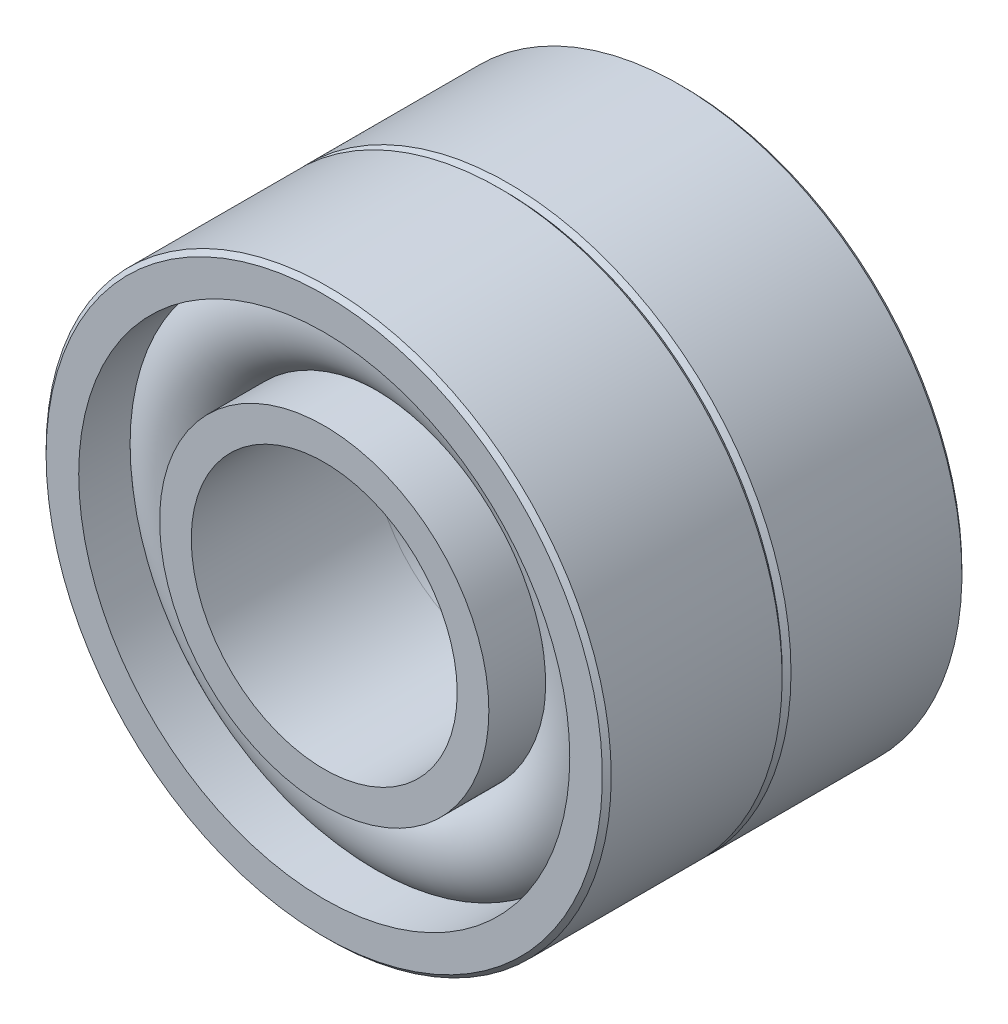
ISO-10303-21;
HEADER;
FILE_DESCRIPTION(('STEP AP214'),'2;1');
FILE_NAME('part.step','',(''),(''),'','','');
FILE_SCHEMA(('AUTOMOTIVE_DESIGN { 1 0 10303 214 1 1 1 1 }'));
ENDSEC;
DATA;
#1=APPLICATION_CONTEXT('core data for automotive mechanical design processes');
#2=APPLICATION_PROTOCOL_DEFINITION('international standard','automotive_design',2000,#1);
#3=PRODUCT_CONTEXT('',#1,'mechanical');
#4=PRODUCT('Part','Part','',(#3));
#5=PRODUCT_RELATED_PRODUCT_CATEGORY('part','',(#4));
#6=PRODUCT_DEFINITION_FORMATION('','',#4);
#7=PRODUCT_DEFINITION_CONTEXT('part definition',#1,'design');
#8=PRODUCT_DEFINITION('design','',#6,#7);
#9=PRODUCT_DEFINITION_SHAPE('','',#8);
#10=(LENGTH_UNIT() NAMED_UNIT(*) SI_UNIT(.MILLI.,.METRE.));
#11=(NAMED_UNIT(*) PLANE_ANGLE_UNIT() SI_UNIT($,.RADIAN.));
#12=(NAMED_UNIT(*) SI_UNIT($,.STERADIAN.) SOLID_ANGLE_UNIT());
#13=UNCERTAINTY_MEASURE_WITH_UNIT(LENGTH_MEASURE(1.E-05),#10,'distance_accuracy_value','');
#14=(GEOMETRIC_REPRESENTATION_CONTEXT(3) GLOBAL_UNCERTAINTY_ASSIGNED_CONTEXT((#13)) GLOBAL_UNIT_ASSIGNED_CONTEXT((#10,
#11,#12)) REPRESENTATION_CONTEXT('',''));
#15=CARTESIAN_POINT('',(0.,0.,0.));
#16=DIRECTION('',(0.,0.,1.));
#17=DIRECTION('',(1.,0.,0.));
#18=AXIS2_PLACEMENT_3D('',#15,#16,#17);
#19=CARTESIAN_POINT('',(0.,0.,0.));
#20=DIRECTION('',(0.,0.,1.));
#21=DIRECTION('',(1.,0.,0.));
#22=AXIS2_PLACEMENT_3D('',#19,#20,#21);
#23=CYLINDRICAL_SURFACE('',#22,6.);
#24=CARTESIAN_POINT('',(0.,0.,-4.05625));
#25=DIRECTION('',(0.,0.,1.));
#26=DIRECTION('',(1.,0.,0.));
#27=AXIS2_PLACEMENT_3D('',#24,#25,#26);
#28=CIRCLE('',#27,6.);
#29=CARTESIAN_POINT('',(6.,0.,-4.05625));
#30=VERTEX_POINT('',#29);
#31=EDGE_CURVE('P0_E18',#30,#30,#28,.F.);
#32=ORIENTED_EDGE('',*,*,#31,.T.);
#33=EDGE_LOOP('',(#32));
#34=FACE_BOUND('',#33,.T.);
#35=CARTESIAN_POINT('',(0.,0.,4.05625));
#36=DIRECTION('',(0.,0.,1.));
#37=DIRECTION('',(1.,0.,0.));
#38=AXIS2_PLACEMENT_3D('',#35,#36,#37);
#39=CIRCLE('',#38,6.);
#40=CARTESIAN_POINT('',(6.,0.,4.05625));
#41=VERTEX_POINT('',#40);
#42=EDGE_CURVE('P0_E75',#41,#41,#39,.T.);
#43=ORIENTED_EDGE('',*,*,#42,.T.);
#44=EDGE_LOOP('',(#43));
#45=FACE_BOUND('',#44,.T.);
#46=ADVANCED_FACE('P0_F15',(#34,#45),#23,.F.);
#47=CARTESIAN_POINT('',(0.,7.428,-4.05625));
#48=DIRECTION('',(0.,0.,1.));
#49=DIRECTION('',(1.,0.,0.));
#50=AXIS2_PLACEMENT_3D('',#47,#48,#49);
#51=PLANE('',#50);
#52=ORIENTED_EDGE('',*,*,#31,.F.);
#53=EDGE_LOOP('',(#52));
#54=FACE_BOUND('',#53,.T.);
#55=CARTESIAN_POINT('',(0.,0.,-4.05625));
#56=DIRECTION('',(0.,0.,1.));
#57=DIRECTION('',(1.,0.,0.));
#58=AXIS2_PLACEMENT_3D('',#55,#56,#57);
#59=CIRCLE('',#58,7.428);
#60=CARTESIAN_POINT('',(7.428,0.,-4.05625));
#61=VERTEX_POINT('',#60);
#62=EDGE_CURVE('P0_E73',#61,#61,#59,.T.);
#63=ORIENTED_EDGE('',*,*,#62,.F.);
#64=EDGE_LOOP('',(#63));
#65=FACE_BOUND('',#64,.T.);
#66=ADVANCED_FACE('P0_F83',(#54,#65),#51,.F.);
#67=CARTESIAN_POINT('',(0.,6.,4.05625));
#68=DIRECTION('',(0.,0.,-1.));
#69=DIRECTION('',(-1.,0.,0.));
#70=AXIS2_PLACEMENT_3D('',#67,#68,#69);
#71=PLANE('',#70);
#72=CARTESIAN_POINT('',(0.,0.,4.05625));
#73=DIRECTION('',(0.,0.,1.));
#74=DIRECTION('',(1.,0.,0.));
#75=AXIS2_PLACEMENT_3D('',#72,#73,#74);
#76=CIRCLE('',#75,7.428);
#77=CARTESIAN_POINT('',(7.428,0.,4.05625));
#78=VERTEX_POINT('',#77);
#79=EDGE_CURVE('P0_E60',#78,#78,#76,.F.);
#80=ORIENTED_EDGE('',*,*,#79,.F.);
#81=EDGE_LOOP('',(#80));
#82=FACE_BOUND('',#81,.T.);
#83=ORIENTED_EDGE('',*,*,#42,.F.);
#84=EDGE_LOOP('',(#83));
#85=FACE_BOUND('',#84,.T.);
#86=ADVANCED_FACE('P0_F86',(#82,#85),#71,.F.);
#87=CARTESIAN_POINT('',(0.,0.,0.));
#88=DIRECTION('',(0.,0.,1.));
#89=DIRECTION('',(1.,0.,0.));
#90=AXIS2_PLACEMENT_3D('',#87,#88,#89);
#91=CYLINDRICAL_SURFACE('',#90,7.428);
#92=CARTESIAN_POINT('',(0.,0.,-1.46025));
#93=DIRECTION('',(0.,0.,1.));
#94=DIRECTION('',(1.,0.,0.));
#95=AXIS2_PLACEMENT_3D('',#92,#93,#94);
#96=CIRCLE('',#95,7.428);
#97=CARTESIAN_POINT('',(7.428,0.,-1.46025));
#98=VERTEX_POINT('',#97);
#99=EDGE_CURVE('P0_E57',#98,#98,#96,.T.);
#100=ORIENTED_EDGE('',*,*,#99,.F.);
#101=EDGE_LOOP('',(#100));
#102=FACE_BOUND('',#101,.T.);
#103=ORIENTED_EDGE('',*,*,#62,.T.);
#104=EDGE_LOOP('',(#103));
#105=FACE_BOUND('',#104,.T.);
#106=ADVANCED_FACE('P0_F89',(#102,#105),#91,.T.);
#107=CARTESIAN_POINT('',(0.,0.,0.));
#108=DIRECTION('',(0.,0.,1.));
#109=DIRECTION('',(1.,0.,0.));
#110=AXIS2_PLACEMENT_3D('',#107,#108,#109);
#111=CYLINDRICAL_SURFACE('',#110,7.428);
#112=ORIENTED_EDGE('',*,*,#79,.T.);
#113=EDGE_LOOP('',(#112));
#114=FACE_BOUND('',#113,.T.);
#115=CARTESIAN_POINT('',(0.,0.,1.46025));
#116=DIRECTION('',(0.,0.,1.));
#117=DIRECTION('',(1.,0.,0.));
#118=AXIS2_PLACEMENT_3D('',#115,#116,#117);
#119=CIRCLE('',#118,7.428);
#120=CARTESIAN_POINT('',(7.428,0.,1.46025));
#121=VERTEX_POINT('',#120);
#122=EDGE_CURVE('P0_E54',#121,#121,#119,.F.);
#123=ORIENTED_EDGE('',*,*,#122,.F.);
#124=EDGE_LOOP('',(#123));
#125=FACE_BOUND('',#124,.T.);
#126=ADVANCED_FACE('P0_F49',(#114,#125),#111,.T.);
#127=CARTESIAN_POINT('',(0.,0.,0.));
#128=DIRECTION('',(0.,0.,1.));
#129=DIRECTION('',(1.,0.,0.));
#130=AXIS2_PLACEMENT_3D('',#127,#128,#129);
#131=TOROIDAL_SURFACE('',#130,9.375,2.43375);
#132=CARTESIAN_POINT('',(0.,0.,0.));
#133=DIRECTION('',(0.,0.,1.));
#134=DIRECTION('',(1.,0.,0.));
#135=AXIS2_PLACEMENT_3D('',#132,#133,#134);
#136=CIRCLE('',#135,11.80875);
#137=CARTESIAN_POINT('',(11.80875,0.,0.));
#138=VERTEX_POINT('',#137);
#139=EDGE_CURVE('P0_E34',#138,#138,#136,.F.);
#140=ORIENTED_EDGE('',*,*,#139,.T.);
#141=EDGE_LOOP('',(#140));
#142=FACE_BOUND('',#141,.T.);
#143=ORIENTED_EDGE('',*,*,#99,.T.);
#144=EDGE_LOOP('',(#143));
#145=FACE_BOUND('',#144,.T.);
#146=ADVANCED_FACE('P0_F44',(#142,#145),#131,.T.);
#147=CARTESIAN_POINT('',(0.,0.,0.));
#148=DIRECTION('',(0.,0.,1.));
#149=DIRECTION('',(1.,0.,0.));
#150=AXIS2_PLACEMENT_3D('',#147,#148,#149);
#151=TOROIDAL_SURFACE('',#150,9.375,2.43375);
#152=ORIENTED_EDGE('',*,*,#122,.T.);
#153=EDGE_LOOP('',(#152));
#154=FACE_BOUND('',#153,.T.);
#155=CARTESIAN_POINT('',(0.,0.,1.73804514379662));
#156=DIRECTION('',(0.,0.,1.));
#157=DIRECTION('',(1.,0.,0.));
#158=AXIS2_PLACEMENT_3D('',#155,#156,#157);
#159=CIRCLE('',#158,11.078625);
#160=CARTESIAN_POINT('',(11.078625,0.,1.73804514379662));
#161=VERTEX_POINT('',#160);
#162=EDGE_CURVE('P0_E30',#161,#161,#159,.T.);
#163=ORIENTED_EDGE('',*,*,#162,.T.);
#164=EDGE_LOOP('',(#163));
#165=FACE_BOUND('',#164,.T.);
#166=ADVANCED_FACE('P0_F39',(#154,#165),#151,.T.);
#167=CARTESIAN_POINT('',(0.,0.,0.));
#168=DIRECTION('',(0.,0.,1.));
#169=DIRECTION('',(1.,0.,0.));
#170=AXIS2_PLACEMENT_3D('',#167,#168,#169);
#171=CYLINDRICAL_SURFACE('',#170,11.80875);
#172=CARTESIAN_POINT('',(0.,0.,-4.05625));
#173=DIRECTION('',(0.,0.,1.));
#174=DIRECTION('',(1.,0.,0.));
#175=AXIS2_PLACEMENT_3D('',#172,#173,#174);
#176=CIRCLE('',#175,11.80875);
#177=CARTESIAN_POINT('',(11.80875,0.,-4.05625));
#178=VERTEX_POINT('',#177);
#179=EDGE_CURVE('P0_E33',#178,#178,#176,.F.);
#180=ORIENTED_EDGE('',*,*,#179,.T.);
#181=EDGE_LOOP('',(#180));
#182=FACE_BOUND('',#181,.T.);
#183=ORIENTED_EDGE('',*,*,#139,.F.);
#184=EDGE_LOOP('',(#183));
#185=FACE_BOUND('',#184,.T.);
#186=ADVANCED_FACE('P0_F43',(#182,#185),#171,.F.);
#187=CARTESIAN_POINT('',(0.,0.,0.));
#188=DIRECTION('',(0.,0.,1.));
#189=DIRECTION('',(1.,0.,0.));
#190=AXIS2_PLACEMENT_3D('',#187,#188,#189);
#191=CYLINDRICAL_SURFACE('',#190,11.078625);
#192=ORIENTED_EDGE('',*,*,#162,.F.);
#193=EDGE_LOOP('',(#192));
#194=FACE_BOUND('',#193,.T.);
#195=CARTESIAN_POINT('',(0.,0.,4.05625));
#196=DIRECTION('',(0.,0.,1.));
#197=DIRECTION('',(1.,0.,0.));
#198=AXIS2_PLACEMENT_3D('',#195,#196,#197);
#199=CIRCLE('',#198,11.078625);
#200=CARTESIAN_POINT('',(11.078625,0.,4.05625));
#201=VERTEX_POINT('',#200);
#202=EDGE_CURVE('P0_E66',#201,#201,#199,.T.);
#203=ORIENTED_EDGE('',*,*,#202,.T.);
#204=EDGE_LOOP('',(#203));
#205=FACE_BOUND('',#204,.T.);
#206=ADVANCED_FACE('P0_F122',(#194,#205),#191,.F.);
#207=CARTESIAN_POINT('',(0.,11.80875,-4.05625));
#208=DIRECTION('',(0.,0.,1.));
#209=DIRECTION('',(1.,0.,0.));
#210=AXIS2_PLACEMENT_3D('',#207,#208,#209);
#211=PLANE('',#210);
#212=ORIENTED_EDGE('',*,*,#179,.F.);
#213=EDGE_LOOP('',(#212));
#214=FACE_BOUND('',#213,.T.);
#215=CARTESIAN_POINT('',(0.,0.,-4.05625));
#216=DIRECTION('',(0.,0.,1.));
#217=DIRECTION('',(0.,-1.,0.));
#218=AXIS2_PLACEMENT_3D('',#215,#216,#217);
#219=CIRCLE('',#218,12.55);
#220=CARTESIAN_POINT('',(0.,-12.55,-4.05625));
#221=VERTEX_POINT('',#220);
#222=EDGE_CURVE('P0_E63',#221,#221,#219,.T.);
#223=ORIENTED_EDGE('',*,*,#222,.F.);
#224=EDGE_LOOP('',(#223));
#225=FACE_BOUND('',#224,.T.);
#226=ADVANCED_FACE('P0_F119',(#214,#225),#211,.F.);
#227=CARTESIAN_POINT('',(0.,12.75,4.05625));
#228=DIRECTION('',(0.,0.,-1.));
#229=DIRECTION('',(-1.,0.,0.));
#230=AXIS2_PLACEMENT_3D('',#227,#228,#229);
#231=PLANE('',#230);
#232=ORIENTED_EDGE('',*,*,#202,.F.);
#233=EDGE_LOOP('',(#232));
#234=FACE_BOUND('',#233,.T.);
#235=CARTESIAN_POINT('',(0.,0.,4.05625));
#236=DIRECTION('',(0.,0.,-1.));
#237=DIRECTION('',(-1.,0.,0.));
#238=AXIS2_PLACEMENT_3D('',#235,#236,#237);
#239=CIRCLE('',#238,12.55);
#240=CARTESIAN_POINT('',(-12.55,0.,4.05625));
#241=VERTEX_POINT('',#240);
#242=EDGE_CURVE('P0_E27',#241,#241,#239,.T.);
#243=ORIENTED_EDGE('',*,*,#242,.F.);
#244=EDGE_LOOP('',(#243));
#245=FACE_BOUND('',#244,.T.);
#246=ADVANCED_FACE('P0_F115',(#234,#245),#231,.F.);
#247=CARTESIAN_POINT('',(0.,0.,-3.85624999999999));
#248=DIRECTION('',(0.,0.,1.));
#249=DIRECTION('',(0.,-1.,0.));
#250=AXIS2_PLACEMENT_3D('',#247,#248,#249);
#251=CONICAL_SURFACE('',#250,12.75,0.785398163397452);
#252=CARTESIAN_POINT('',(0.,0.,-3.85625));
#253=DIRECTION('',(0.,0.,1.));
#254=DIRECTION('',(1.,0.,0.));
#255=AXIS2_PLACEMENT_3D('',#252,#253,#254);
#256=CIRCLE('',#255,12.75);
#257=CARTESIAN_POINT('',(12.75,0.,-3.85625));
#258=VERTEX_POINT('',#257);
#259=EDGE_CURVE('P0_E22',#258,#258,#256,.T.);
#260=ORIENTED_EDGE('',*,*,#259,.F.);
#261=EDGE_LOOP('',(#260));
#262=FACE_BOUND('',#261,.T.);
#263=ORIENTED_EDGE('',*,*,#222,.T.);
#264=EDGE_LOOP('',(#263));
#265=FACE_BOUND('',#264,.T.);
#266=ADVANCED_FACE('P0_F108',(#262,#265),#251,.T.);
#267=CARTESIAN_POINT('',(0.,0.,3.85625));
#268=DIRECTION('',(0.,0.,-1.));
#269=DIRECTION('',(-1.,0.,0.));
#270=AXIS2_PLACEMENT_3D('',#267,#268,#269);
#271=CONICAL_SURFACE('',#270,12.75,0.785398163397453);
#272=CARTESIAN_POINT('',(0.,0.,3.85625));
#273=DIRECTION('',(0.,0.,1.));
#274=DIRECTION('',(1.,0.,0.));
#275=AXIS2_PLACEMENT_3D('',#272,#273,#274);
#276=CIRCLE('',#275,12.75);
#277=CARTESIAN_POINT('',(12.75,0.,3.85625));
#278=VERTEX_POINT('',#277);
#279=EDGE_CURVE('P0_E10',#278,#278,#276,.F.);
#280=ORIENTED_EDGE('',*,*,#279,.F.);
#281=EDGE_LOOP('',(#280));
#282=FACE_BOUND('',#281,.T.);
#283=ORIENTED_EDGE('',*,*,#242,.T.);
#284=EDGE_LOOP('',(#283));
#285=FACE_BOUND('',#284,.T.);
#286=ADVANCED_FACE('P0_F103',(#282,#285),#271,.T.);
#287=CARTESIAN_POINT('',(0.,0.,0.));
#288=DIRECTION('',(0.,0.,1.));
#289=DIRECTION('',(1.,0.,0.));
#290=AXIS2_PLACEMENT_3D('',#287,#288,#289);
#291=CYLINDRICAL_SURFACE('',#290,12.75);
#292=ORIENTED_EDGE('',*,*,#279,.T.);
#293=EDGE_LOOP('',(#292));
#294=FACE_BOUND('',#293,.T.);
#295=ORIENTED_EDGE('',*,*,#259,.T.);
#296=EDGE_LOOP('',(#295));
#297=FACE_BOUND('',#296,.T.);
#298=ADVANCED_FACE('P0_F101',(#294,#297),#291,.T.);
#299=CLOSED_SHELL('',(#46,#66,#86,#106,#126,#146,#166,#186,#206,#226,#246,#266,#286,#298));
#300=MANIFOLD_SOLID_BREP('P0_B1',#299);
#301=CARTESIAN_POINT('',(0.,0.,-8.1125));
#302=DIRECTION('',(0.,0.,-1.));
#303=DIRECTION('',(-1.,0.,0.));
#304=AXIS2_PLACEMENT_3D('',#301,#302,#303);
#305=CYLINDRICAL_SURFACE('',#304,6.);
#306=CARTESIAN_POINT('',(0.,0.,-12.16875));
#307=DIRECTION('',(0.,0.,-1.));
#308=DIRECTION('',(-1.,0.,0.));
#309=AXIS2_PLACEMENT_3D('',#306,#307,#308);
#310=CIRCLE('',#309,6.);
#311=CARTESIAN_POINT('',(-6.,0.,-12.16875));
#312=VERTEX_POINT('',#311);
#313=EDGE_CURVE('P1_E74',#312,#312,#310,.T.);
#314=ORIENTED_EDGE('',*,*,#313,.T.);
#315=EDGE_LOOP('',(#314));
#316=FACE_BOUND('',#315,.T.);
#317=CARTESIAN_POINT('',(0.,0.,-4.05625));
#318=DIRECTION('',(0.,0.,-1.));
#319=DIRECTION('',(-1.,0.,0.));
#320=AXIS2_PLACEMENT_3D('',#317,#318,#319);
#321=CIRCLE('',#320,6.);
#322=CARTESIAN_POINT('',(-6.,0.,-4.05625));
#323=VERTEX_POINT('',#322);
#324=EDGE_CURVE('P1_E18',#323,#323,#321,.F.);
#325=ORIENTED_EDGE('',*,*,#324,.T.);
#326=EDGE_LOOP('',(#325));
#327=FACE_BOUND('',#326,.T.);
#328=ADVANCED_FACE('P1_F15',(#316,#327),#305,.F.);
#329=CARTESIAN_POINT('',(0.,7.428,-4.05625));
#330=DIRECTION('',(0.,0.,-1.));
#331=DIRECTION('',(-1.,0.,0.));
#332=AXIS2_PLACEMENT_3D('',#329,#330,#331);
#333=PLANE('',#332);
#334=ORIENTED_EDGE('',*,*,#324,.F.);
#335=EDGE_LOOP('',(#334));
#336=FACE_BOUND('',#335,.T.);
#337=CARTESIAN_POINT('',(0.,0.,-4.05625));
#338=DIRECTION('',(0.,0.,-1.));
#339=DIRECTION('',(-1.,0.,0.));
#340=AXIS2_PLACEMENT_3D('',#337,#338,#339);
#341=CIRCLE('',#340,7.428);
#342=CARTESIAN_POINT('',(-7.428,0.,-4.05625));
#343=VERTEX_POINT('',#342);
#344=EDGE_CURVE('P1_E72',#343,#343,#341,.T.);
#345=ORIENTED_EDGE('',*,*,#344,.F.);
#346=EDGE_LOOP('',(#345));
#347=FACE_BOUND('',#346,.T.);
#348=ADVANCED_FACE('P1_F82',(#336,#347),#333,.F.);
#349=CARTESIAN_POINT('',(0.,6.,-12.16875));
#350=DIRECTION('',(0.,0.,1.));
#351=DIRECTION('',(1.,0.,0.));
#352=AXIS2_PLACEMENT_3D('',#349,#350,#351);
#353=PLANE('',#352);
#354=CARTESIAN_POINT('',(0.,0.,-12.16875));
#355=DIRECTION('',(0.,0.,-1.));
#356=DIRECTION('',(-1.,0.,0.));
#357=AXIS2_PLACEMENT_3D('',#354,#355,#356);
#358=CIRCLE('',#357,7.428);
#359=CARTESIAN_POINT('',(-7.428,0.,-12.16875));
#360=VERTEX_POINT('',#359);
#361=EDGE_CURVE('P1_E58',#360,#360,#358,.F.);
#362=ORIENTED_EDGE('',*,*,#361,.F.);
#363=EDGE_LOOP('',(#362));
#364=FACE_BOUND('',#363,.T.);
#365=ORIENTED_EDGE('',*,*,#313,.F.);
#366=EDGE_LOOP('',(#365));
#367=FACE_BOUND('',#366,.T.);
#368=ADVANCED_FACE('P1_F85',(#364,#367),#353,.F.);
#369=CARTESIAN_POINT('',(0.,0.,-8.1125));
#370=DIRECTION('',(0.,0.,-1.));
#371=DIRECTION('',(-1.,0.,0.));
#372=AXIS2_PLACEMENT_3D('',#369,#370,#371);
#373=CYLINDRICAL_SURFACE('',#372,7.428);
#374=ORIENTED_EDGE('',*,*,#344,.T.);
#375=EDGE_LOOP('',(#374));
#376=FACE_BOUND('',#375,.T.);
#377=CARTESIAN_POINT('',(0.,0.,-6.65225));
#378=DIRECTION('',(0.,0.,-1.));
#379=DIRECTION('',(1.,0.,0.));
#380=AXIS2_PLACEMENT_3D('',#377,#378,#379);
#381=CIRCLE('',#380,7.428);
#382=CARTESIAN_POINT('',(7.428,0.,-6.65225));
#383=VERTEX_POINT('',#382);
#384=EDGE_CURVE('P1_E55',#383,#383,#381,.T.);
#385=ORIENTED_EDGE('',*,*,#384,.F.);
#386=EDGE_LOOP('',(#385));
#387=FACE_BOUND('',#386,.T.);
#388=ADVANCED_FACE('P1_F88',(#376,#387),#373,.T.);
#389=CARTESIAN_POINT('',(0.,0.,-8.1125));
#390=DIRECTION('',(0.,0.,-1.));
#391=DIRECTION('',(-1.,0.,0.));
#392=AXIS2_PLACEMENT_3D('',#389,#390,#391);
#393=CYLINDRICAL_SURFACE('',#392,7.428);
#394=CARTESIAN_POINT('',(0.,0.,-9.57275));
#395=DIRECTION('',(0.,0.,-1.));
#396=DIRECTION('',(1.,0.,0.));
#397=AXIS2_PLACEMENT_3D('',#394,#395,#396);
#398=CIRCLE('',#397,7.428);
#399=CARTESIAN_POINT('',(7.428,0.,-9.57275));
#400=VERTEX_POINT('',#399);
#401=EDGE_CURVE('P1_E52',#400,#400,#398,.F.);
#402=ORIENTED_EDGE('',*,*,#401,.F.);
#403=EDGE_LOOP('',(#402));
#404=FACE_BOUND('',#403,.T.);
#405=ORIENTED_EDGE('',*,*,#361,.T.);
#406=EDGE_LOOP('',(#405));
#407=FACE_BOUND('',#406,.T.);
#408=ADVANCED_FACE('P1_F46',(#404,#407),#393,.T.);
#409=CARTESIAN_POINT('',(0.,0.,-8.1125));
#410=DIRECTION('',(0.,0.,-1.));
#411=DIRECTION('',(1.,0.,0.));
#412=AXIS2_PLACEMENT_3D('',#409,#410,#411);
#413=TOROIDAL_SURFACE('',#412,9.375,2.43375);
#414=ORIENTED_EDGE('',*,*,#384,.T.);
#415=EDGE_LOOP('',(#414));
#416=FACE_BOUND('',#415,.T.);
#417=CARTESIAN_POINT('',(0.,0.,-8.1125));
#418=DIRECTION('',(0.,0.,-1.));
#419=DIRECTION('',(-1.,0.,0.));
#420=AXIS2_PLACEMENT_3D('',#417,#418,#419);
#421=CIRCLE('',#420,11.80875);
#422=CARTESIAN_POINT('',(-11.80875,0.,-8.1125));
#423=VERTEX_POINT('',#422);
#424=EDGE_CURVE('P1_E51',#423,#423,#421,.F.);
#425=ORIENTED_EDGE('',*,*,#424,.T.);
#426=EDGE_LOOP('',(#425));
#427=FACE_BOUND('',#426,.T.);
#428=ADVANCED_FACE('P1_F40',(#416,#427),#413,.T.);
#429=CARTESIAN_POINT('',(0.,0.,-8.1125));
#430=DIRECTION('',(0.,0.,-1.));
#431=DIRECTION('',(1.,0.,0.));
#432=AXIS2_PLACEMENT_3D('',#429,#430,#431);
#433=TOROIDAL_SURFACE('',#432,9.375,2.43375);
#434=CARTESIAN_POINT('',(0.,0.,-9.85054514379662));
#435=DIRECTION('',(0.,0.,-1.));
#436=DIRECTION('',(-1.,0.,0.));
#437=AXIS2_PLACEMENT_3D('',#434,#435,#436);
#438=CIRCLE('',#437,11.078625);
#439=CARTESIAN_POINT('',(-11.078625,0.,-9.85054514379662));
#440=VERTEX_POINT('',#439);
#441=EDGE_CURVE('P1_E32',#440,#440,#438,.T.);
#442=ORIENTED_EDGE('',*,*,#441,.T.);
#443=EDGE_LOOP('',(#442));
#444=FACE_BOUND('',#443,.T.);
#445=ORIENTED_EDGE('',*,*,#401,.T.);
#446=EDGE_LOOP('',(#445));
#447=FACE_BOUND('',#446,.T.);
#448=ADVANCED_FACE('P1_F35',(#444,#447),#433,.T.);
#449=CARTESIAN_POINT('',(0.,0.,-8.1125));
#450=DIRECTION('',(0.,0.,-1.));
#451=DIRECTION('',(-1.,0.,0.));
#452=AXIS2_PLACEMENT_3D('',#449,#450,#451);
#453=CYLINDRICAL_SURFACE('',#452,11.80875);
#454=ORIENTED_EDGE('',*,*,#424,.F.);
#455=EDGE_LOOP('',(#454));
#456=FACE_BOUND('',#455,.T.);
#457=CARTESIAN_POINT('',(0.,0.,-4.05625));
#458=DIRECTION('',(0.,0.,-1.));
#459=DIRECTION('',(-1.,0.,0.));
#460=AXIS2_PLACEMENT_3D('',#457,#458,#459);
#461=CIRCLE('',#460,11.80875);
#462=CARTESIAN_POINT('',(-11.80875,0.,-4.05625));
#463=VERTEX_POINT('',#462);
#464=EDGE_CURVE('P1_E67',#463,#463,#461,.F.);
#465=ORIENTED_EDGE('',*,*,#464,.T.);
#466=EDGE_LOOP('',(#465));
#467=FACE_BOUND('',#466,.T.);
#468=ADVANCED_FACE('P1_F39',(#456,#467),#453,.F.);
#469=CARTESIAN_POINT('',(0.,0.,-8.1125));
#470=DIRECTION('',(0.,0.,-1.));
#471=DIRECTION('',(-1.,0.,0.));
#472=AXIS2_PLACEMENT_3D('',#469,#470,#471);
#473=CYLINDRICAL_SURFACE('',#472,11.078625);
#474=CARTESIAN_POINT('',(0.,0.,-12.16875));
#475=DIRECTION('',(0.,0.,-1.));
#476=DIRECTION('',(-1.,0.,0.));
#477=AXIS2_PLACEMENT_3D('',#474,#475,#476);
#478=CIRCLE('',#477,11.078625);
#479=CARTESIAN_POINT('',(-11.078625,0.,-12.16875));
#480=VERTEX_POINT('',#479);
#481=EDGE_CURVE('P1_E64',#480,#480,#478,.T.);
#482=ORIENTED_EDGE('',*,*,#481,.T.);
#483=EDGE_LOOP('',(#482));
#484=FACE_BOUND('',#483,.T.);
#485=ORIENTED_EDGE('',*,*,#441,.F.);
#486=EDGE_LOOP('',(#485));
#487=FACE_BOUND('',#486,.T.);
#488=ADVANCED_FACE('P1_F100',(#484,#487),#473,.F.);
#489=CARTESIAN_POINT('',(0.,11.80875,-4.05625));
#490=DIRECTION('',(0.,0.,-1.));
#491=DIRECTION('',(-1.,0.,0.));
#492=AXIS2_PLACEMENT_3D('',#489,#490,#491);
#493=PLANE('',#492);
#494=ORIENTED_EDGE('',*,*,#464,.F.);
#495=EDGE_LOOP('',(#494));
#496=FACE_BOUND('',#495,.T.);
#497=CARTESIAN_POINT('',(0.,0.,-4.05625));
#498=DIRECTION('',(0.,0.,-1.));
#499=DIRECTION('',(-1.,0.,0.));
#500=AXIS2_PLACEMENT_3D('',#497,#498,#499);
#501=CIRCLE('',#500,12.55);
#502=CARTESIAN_POINT('',(-12.55,0.,-4.05625));
#503=VERTEX_POINT('',#502);
#504=EDGE_CURVE('P1_E61',#503,#503,#501,.T.);
#505=ORIENTED_EDGE('',*,*,#504,.F.);
#506=EDGE_LOOP('',(#505));
#507=FACE_BOUND('',#506,.T.);
#508=ADVANCED_FACE('P1_F102',(#496,#507),#493,.F.);
#509=CARTESIAN_POINT('',(0.,12.75,-12.16875));
#510=DIRECTION('',(0.,0.,1.));
#511=DIRECTION('',(1.,0.,0.));
#512=AXIS2_PLACEMENT_3D('',#509,#510,#511);
#513=PLANE('',#512);
#514=ORIENTED_EDGE('',*,*,#481,.F.);
#515=EDGE_LOOP('',(#514));
#516=FACE_BOUND('',#515,.T.);
#517=CARTESIAN_POINT('',(0.,0.,-12.16875));
#518=DIRECTION('',(0.,0.,1.));
#519=DIRECTION('',(0.,-1.,0.));
#520=AXIS2_PLACEMENT_3D('',#517,#518,#519);
#521=CIRCLE('',#520,12.55);
#522=CARTESIAN_POINT('',(0.,-12.55,-12.16875));
#523=VERTEX_POINT('',#522);
#524=EDGE_CURVE('P1_E27',#523,#523,#521,.T.);
#525=ORIENTED_EDGE('',*,*,#524,.F.);
#526=EDGE_LOOP('',(#525));
#527=FACE_BOUND('',#526,.T.);
#528=ADVANCED_FACE('P1_F109',(#516,#527),#513,.F.);
#529=CARTESIAN_POINT('',(0.,0.,-4.25625));
#530=DIRECTION('',(0.,0.,-1.));
#531=DIRECTION('',(-1.,0.,0.));
#532=AXIS2_PLACEMENT_3D('',#529,#530,#531);
#533=CONICAL_SURFACE('',#532,12.75,0.78539816339745);
#534=CARTESIAN_POINT('',(0.,0.,-4.25625));
#535=DIRECTION('',(0.,0.,-1.));
#536=DIRECTION('',(-1.,0.,0.));
#537=AXIS2_PLACEMENT_3D('',#534,#535,#536);
#538=CIRCLE('',#537,12.75);
#539=CARTESIAN_POINT('',(-12.75,0.,-4.25625));
#540=VERTEX_POINT('',#539);
#541=EDGE_CURVE('P1_E22',#540,#540,#538,.T.);
#542=ORIENTED_EDGE('',*,*,#541,.F.);
#543=EDGE_LOOP('',(#542));
#544=FACE_BOUND('',#543,.T.);
#545=ORIENTED_EDGE('',*,*,#504,.T.);
#546=EDGE_LOOP('',(#545));
#547=FACE_BOUND('',#546,.T.);
#548=ADVANCED_FACE('P1_F119',(#544,#547),#533,.T.);
#549=CARTESIAN_POINT('',(0.,0.,-11.96875));
#550=DIRECTION('',(0.,0.,1.));
#551=DIRECTION('',(0.,-1.,0.));
#552=AXIS2_PLACEMENT_3D('',#549,#550,#551);
#553=CONICAL_SURFACE('',#552,12.75,0.785398163397453);
#554=CARTESIAN_POINT('',(0.,0.,-11.96875));
#555=DIRECTION('',(0.,0.,-1.));
#556=DIRECTION('',(-1.,0.,0.));
#557=AXIS2_PLACEMENT_3D('',#554,#555,#556);
#558=CIRCLE('',#557,12.75);
#559=CARTESIAN_POINT('',(-12.75,0.,-11.96875));
#560=VERTEX_POINT('',#559);
#561=EDGE_CURVE('P1_E10',#560,#560,#558,.F.);
#562=ORIENTED_EDGE('',*,*,#561,.F.);
#563=EDGE_LOOP('',(#562));
#564=FACE_BOUND('',#563,.T.);
#565=ORIENTED_EDGE('',*,*,#524,.T.);
#566=EDGE_LOOP('',(#565));
#567=FACE_BOUND('',#566,.T.);
#568=ADVANCED_FACE('P1_F114',(#564,#567),#553,.T.);
#569=CARTESIAN_POINT('',(0.,0.,-8.1125));
#570=DIRECTION('',(0.,0.,-1.));
#571=DIRECTION('',(-1.,0.,0.));
#572=AXIS2_PLACEMENT_3D('',#569,#570,#571);
#573=CYLINDRICAL_SURFACE('',#572,12.75);
#574=ORIENTED_EDGE('',*,*,#561,.T.);
#575=EDGE_LOOP('',(#574));
#576=FACE_BOUND('',#575,.T.);
#577=ORIENTED_EDGE('',*,*,#541,.T.);
#578=EDGE_LOOP('',(#577));
#579=FACE_BOUND('',#578,.T.);
#580=ADVANCED_FACE('P1_F112',(#576,#579),#573,.T.);
#581=CLOSED_SHELL('',(#328,#348,#368,#388,#408,#428,#448,#468,#488,#508,#528,#548,#568,#580));
#582=MANIFOLD_SOLID_BREP('P1_B1',#581);
#583=ADVANCED_BREP_SHAPE_REPRESENTATION('',(#18,#300,#582),#14);
#584=SHAPE_DEFINITION_REPRESENTATION(#9,#583);
ENDSEC;
END-ISO-10303-21;
